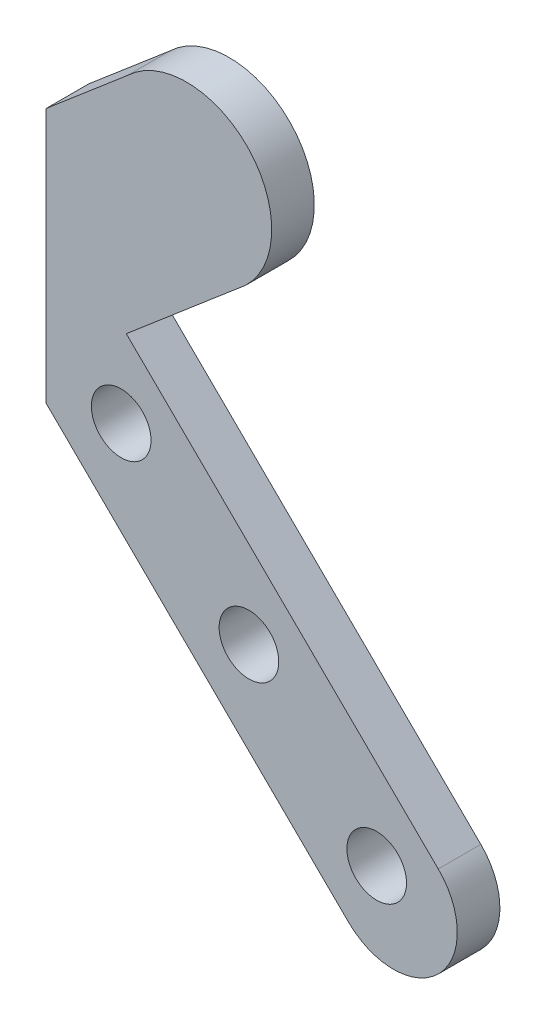
ISO-10303-21;
HEADER;
FILE_DESCRIPTION(('STEP AP214'),'2;1');
FILE_NAME('part.step','',(''),(''),'','','');
FILE_SCHEMA(('AUTOMOTIVE_DESIGN { 1 0 10303 214 1 1 1 1 }'));
ENDSEC;
DATA;
#1=APPLICATION_CONTEXT('core data for automotive mechanical design processes');
#2=APPLICATION_PROTOCOL_DEFINITION('international standard','automotive_design',2000,#1);
#3=PRODUCT_CONTEXT('',#1,'mechanical');
#4=PRODUCT('Part','Part','',(#3));
#5=PRODUCT_RELATED_PRODUCT_CATEGORY('part','',(#4));
#6=PRODUCT_DEFINITION_FORMATION('','',#4);
#7=PRODUCT_DEFINITION_CONTEXT('part definition',#1,'design');
#8=PRODUCT_DEFINITION('design','',#6,#7);
#9=PRODUCT_DEFINITION_SHAPE('','',#8);
#10=(LENGTH_UNIT() NAMED_UNIT(*) SI_UNIT(.MILLI.,.METRE.));
#11=(NAMED_UNIT(*) PLANE_ANGLE_UNIT() SI_UNIT($,.RADIAN.));
#12=(NAMED_UNIT(*) SI_UNIT($,.STERADIAN.) SOLID_ANGLE_UNIT());
#13=UNCERTAINTY_MEASURE_WITH_UNIT(LENGTH_MEASURE(1.E-05),#10,'distance_accuracy_value','');
#14=(GEOMETRIC_REPRESENTATION_CONTEXT(3) GLOBAL_UNCERTAINTY_ASSIGNED_CONTEXT((#13)) GLOBAL_UNIT_ASSIGNED_CONTEXT((#10,
#11,#12)) REPRESENTATION_CONTEXT('',''));
#15=CARTESIAN_POINT('',(0.,0.,0.));
#16=DIRECTION('',(0.,0.,1.));
#17=DIRECTION('',(1.,0.,0.));
#18=AXIS2_PLACEMENT_3D('',#15,#16,#17);
#19=CARTESIAN_POINT('',(5.54977373916184,-33.3031172111803,10.));
#20=DIRECTION('',(0.648204247100734,-0.761466515377118,0.));
#21=DIRECTION('',(0.761466515377118,0.648204247100734,0.));
#22=AXIS2_PLACEMENT_3D('',#19,#20,#21);
#23=PLANE('',#22);
#24=DIRECTION('',(-0.761466515377118,-0.648204247100734,0.));
#25=VECTOR('',#24,1.);
#26=CARTESIAN_POINT('',(5.54977373916184,-33.3031172111803,0.));
#27=LINE('',#26,#25);
#28=CARTESIAN_POINT('',(24.5864366235898,-17.098011033662,0.));
#29=VERTEX_POINT('',#28);
#30=CARTESIAN_POINT('',(5.54977373916184,-33.3031172111803,0.));
#31=VERTEX_POINT('',#30);
#32=EDGE_CURVE('E123',#29,#31,#27,.T.);
#33=ORIENTED_EDGE('',*,*,#32,.T.);
#34=DIRECTION('',(0.,0.,-1.));
#35=VECTOR('',#34,1.);
#36=CARTESIAN_POINT('',(5.54977373916184,-33.3031172111803,10.));
#37=LINE('',#36,#35);
#38=CARTESIAN_POINT('',(5.54977373916184,-33.3031172111803,10.));
#39=VERTEX_POINT('',#38);
#40=EDGE_CURVE('E11',#39,#31,#37,.T.);
#41=ORIENTED_EDGE('',*,*,#40,.F.);
#42=DIRECTION('',(-0.761466515377118,-0.648204247100734,0.));
#43=VECTOR('',#42,1.);
#44=CARTESIAN_POINT('',(5.54977373916184,-33.3031172111803,10.));
#45=LINE('',#44,#43);
#46=CARTESIAN_POINT('',(24.5864366235898,-17.098011033662,10.));
#47=VERTEX_POINT('',#46);
#48=EDGE_CURVE('E136',#47,#39,#45,.T.);
#49=ORIENTED_EDGE('',*,*,#48,.F.);
#50=DIRECTION('',(0.,0.,-1.));
#51=VECTOR('',#50,1.);
#52=CARTESIAN_POINT('',(24.5864366235898,-17.098011033662,10.));
#53=LINE('',#52,#51);
#54=EDGE_CURVE('E119',#47,#29,#53,.T.);
#55=ORIENTED_EDGE('',*,*,#54,.T.);
#56=EDGE_LOOP('',(#33,#41,#49,#55));
#57=FACE_BOUND('',#56,.T.);
#58=ADVANCED_FACE('F33',(#57),#23,.F.);
#59=CARTESIAN_POINT('',(5.54977373916184,-33.3031172111803,10.));
#60=DIRECTION('',(1.,0.,0.));
#61=DIRECTION('',(0.,1.,0.));
#62=AXIS2_PLACEMENT_3D('',#59,#60,#61);
#63=PLANE('',#62);
#64=DIRECTION('',(0.,-1.,0.));
#65=VECTOR('',#64,1.);
#66=CARTESIAN_POINT('',(5.54977373916184,-33.3031172111803,0.));
#67=LINE('',#66,#65);
#68=CARTESIAN_POINT('',(5.54977373916185,-93.3031172111803,0.));
#69=VERTEX_POINT('',#68);
#70=EDGE_CURVE('E126',#31,#69,#67,.T.);
#71=ORIENTED_EDGE('',*,*,#70,.T.);
#72=DIRECTION('',(0.,0.,-1.));
#73=VECTOR('',#72,1.);
#74=CARTESIAN_POINT('',(5.54977373916185,-93.3031172111803,10.));
#75=LINE('',#74,#73);
#76=CARTESIAN_POINT('',(5.54977373916185,-93.3031172111803,10.));
#77=VERTEX_POINT('',#76);
#78=EDGE_CURVE('E41',#77,#69,#75,.T.);
#79=ORIENTED_EDGE('',*,*,#78,.F.);
#80=DIRECTION('',(0.,-1.,0.));
#81=VECTOR('',#80,1.);
#82=CARTESIAN_POINT('',(5.54977373916184,-33.3031172111803,10.));
#83=LINE('',#82,#81);
#84=EDGE_CURVE('E89',#39,#77,#83,.T.);
#85=ORIENTED_EDGE('',*,*,#84,.F.);
#86=ORIENTED_EDGE('',*,*,#40,.T.);
#87=EDGE_LOOP('',(#71,#79,#85,#86));
#88=FACE_BOUND('',#87,.T.);
#89=ADVANCED_FACE('F208',(#88),#63,.F.);
#90=CARTESIAN_POINT('',(5.54977373916185,-93.3031172111803,10.));
#91=DIRECTION('',(0.702074182784828,0.712103813967469,0.));
#92=DIRECTION('',(-0.712103813967469,0.702074182784828,0.));
#93=AXIS2_PLACEMENT_3D('',#90,#91,#92);
#94=PLANE('',#93);
#95=DIRECTION('',(0.712103813967469,-0.702074182784828,0.));
#96=VECTOR('',#95,1.);
#97=CARTESIAN_POINT('',(5.54977373916185,-93.3031172111803,0.));
#98=LINE('',#97,#96);
#99=CARTESIAN_POINT('',(76.5497737391619,-163.30311721118,0.));
#100=VERTEX_POINT('',#99);
#101=EDGE_CURVE('E129',#69,#100,#98,.T.);
#102=ORIENTED_EDGE('',*,*,#101,.T.);
#103=DIRECTION('',(0.,0.,-1.));
#104=VECTOR('',#103,1.);
#105=CARTESIAN_POINT('',(76.5497737391619,-163.30311721118,10.));
#106=LINE('',#105,#104);
#107=CARTESIAN_POINT('',(76.5497737391619,-163.30311721118,10.));
#108=VERTEX_POINT('',#107);
#109=EDGE_CURVE('E140',#108,#100,#106,.T.);
#110=ORIENTED_EDGE('',*,*,#109,.F.);
#111=DIRECTION('',(0.712103813967469,-0.702074182784828,0.));
#112=VECTOR('',#111,1.);
#113=CARTESIAN_POINT('',(5.54977373916185,-93.3031172111803,10.));
#114=LINE('',#113,#112);
#115=EDGE_CURVE('E148',#77,#108,#114,.T.);
#116=ORIENTED_EDGE('',*,*,#115,.F.);
#117=ORIENTED_EDGE('',*,*,#78,.T.);
#118=EDGE_LOOP('',(#102,#110,#116,#117));
#119=FACE_BOUND('',#118,.T.);
#120=ADVANCED_FACE('F146',(#119),#94,.F.);
#121=CARTESIAN_POINT('',(87.0808864809343,-152.621560001668,10.));
#122=DIRECTION('',(0.,0.,-1.));
#123=DIRECTION('',(-1.,0.,0.));
#124=AXIS2_PLACEMENT_3D('',#121,#122,#123);
#125=CYLINDRICAL_SURFACE('',#124,15.);
#126=CARTESIAN_POINT('',(87.0808864809343,-152.621560001668,0.));
#127=DIRECTION('',(0.,0.,1.));
#128=DIRECTION('',(1.,0.,0.));
#129=AXIS2_PLACEMENT_3D('',#126,#127,#128);
#130=CIRCLE('',#129,15.);
#131=CARTESIAN_POINT('',(97.6119992227067,-141.940002792156,0.));
#132=VERTEX_POINT('',#131);
#133=EDGE_CURVE('E131',#100,#132,#130,.T.);
#134=ORIENTED_EDGE('',*,*,#133,.T.);
#135=DIRECTION('',(0.,0.,-1.));
#136=VECTOR('',#135,1.);
#137=CARTESIAN_POINT('',(97.6119992227067,-141.940002792156,10.));
#138=LINE('',#137,#136);
#139=CARTESIAN_POINT('',(97.6119992227067,-141.940002792156,10.));
#140=VERTEX_POINT('',#139);
#141=EDGE_CURVE('E114',#140,#132,#138,.T.);
#142=ORIENTED_EDGE('',*,*,#141,.F.);
#143=CARTESIAN_POINT('',(87.0808864809343,-152.621560001668,10.));
#144=DIRECTION('',(0.,0.,1.));
#145=DIRECTION('',(1.,0.,0.));
#146=AXIS2_PLACEMENT_3D('',#143,#144,#145);
#147=CIRCLE('',#146,15.);
#148=EDGE_CURVE('E105',#108,#140,#147,.T.);
#149=ORIENTED_EDGE('',*,*,#148,.F.);
#150=ORIENTED_EDGE('',*,*,#109,.T.);
#151=EDGE_LOOP('',(#134,#142,#149,#150));
#152=FACE_BOUND('',#151,.T.);
#153=ADVANCED_FACE('F154',(#152),#125,.T.);
#154=CARTESIAN_POINT('',(97.6119992227067,-141.940002792156,10.));
#155=DIRECTION('',(-0.702074182784828,-0.712103813967469,0.));
#156=DIRECTION('',(0.712103813967469,-0.702074182784828,0.));
#157=AXIS2_PLACEMENT_3D('',#154,#155,#156);
#158=PLANE('',#157);
#159=DIRECTION('',(-0.712103813967469,0.702074182784828,0.));
#160=VECTOR('',#159,1.);
#161=CARTESIAN_POINT('',(97.6119992227067,-141.940002792156,0.));
#162=LINE('',#161,#160);
#163=CARTESIAN_POINT('',(24.3558809134944,-69.7156607971582,0.));
#164=VERTEX_POINT('',#163);
#165=EDGE_CURVE('E113',#132,#164,#162,.T.);
#166=ORIENTED_EDGE('',*,*,#165,.T.);
#167=DIRECTION('',(0.,0.,-1.));
#168=VECTOR('',#167,1.);
#169=CARTESIAN_POINT('',(24.3558809134944,-69.7156607971582,10.));
#170=LINE('',#169,#168);
#171=CARTESIAN_POINT('',(24.3558809134944,-69.7156607971582,10.));
#172=VERTEX_POINT('',#171);
#173=EDGE_CURVE('E110',#172,#164,#170,.T.);
#174=ORIENTED_EDGE('',*,*,#173,.F.);
#175=DIRECTION('',(-0.712103813967469,0.702074182784828,0.));
#176=VECTOR('',#175,1.);
#177=CARTESIAN_POINT('',(97.6119992227067,-141.940002792156,10.));
#178=LINE('',#177,#176);
#179=EDGE_CURVE('E99',#140,#172,#178,.T.);
#180=ORIENTED_EDGE('',*,*,#179,.F.);
#181=ORIENTED_EDGE('',*,*,#141,.T.);
#182=EDGE_LOOP('',(#166,#174,#180,#181));
#183=FACE_BOUND('',#182,.T.);
#184=ADVANCED_FACE('F111',(#183),#158,.F.);
#185=CARTESIAN_POINT('',(24.3558809134944,-69.7156607971582,10.));
#186=DIRECTION('',(-0.648204247100734,0.761466515377118,0.));
#187=DIRECTION('',(-0.761466515377118,-0.648204247100734,0.));
#188=AXIS2_PLACEMENT_3D('',#185,#186,#187);
#189=PLANE('',#188);
#190=DIRECTION('',(0.761466515377118,0.648204247100734,0.));
#191=VECTOR('',#190,1.);
#192=CARTESIAN_POINT('',(24.3558809134944,-69.7156607971582,0.));
#193=LINE('',#192,#191);
#194=CARTESIAN_POINT('',(52.4204851505876,-45.8254498787232,0.));
#195=VERTEX_POINT('',#194);
#196=EDGE_CURVE('E75',#164,#195,#193,.T.);
#197=ORIENTED_EDGE('',*,*,#196,.T.);
#198=DIRECTION('',(0.,0.,-1.));
#199=VECTOR('',#198,1.);
#200=CARTESIAN_POINT('',(52.4204851505876,-45.8254498787232,10.));
#201=LINE('',#200,#199);
#202=CARTESIAN_POINT('',(52.4204851505876,-45.8254498787232,10.));
#203=VERTEX_POINT('',#202);
#204=EDGE_CURVE('E115',#203,#195,#201,.T.);
#205=ORIENTED_EDGE('',*,*,#204,.F.);
#206=DIRECTION('',(0.761466515377118,0.648204247100734,0.));
#207=VECTOR('',#206,1.);
#208=CARTESIAN_POINT('',(24.3558809134944,-69.7156607971582,10.));
#209=LINE('',#208,#207);
#210=EDGE_CURVE('E103',#172,#203,#209,.T.);
#211=ORIENTED_EDGE('',*,*,#210,.F.);
#212=ORIENTED_EDGE('',*,*,#173,.T.);
#213=EDGE_LOOP('',(#197,#205,#211,#212));
#214=FACE_BOUND('',#213,.T.);
#215=ADVANCED_FACE('F117',(#214),#189,.F.);
#216=CARTESIAN_POINT('',(38.5034608870887,-31.4617304561926,10.));
#217=DIRECTION('',(0.,0.,-1.));
#218=DIRECTION('',(-1.,0.,0.));
#219=AXIS2_PLACEMENT_3D('',#216,#217,#218);
#220=CYLINDRICAL_SURFACE('',#219,20.);
#221=CARTESIAN_POINT('',(38.5034608870887,-31.4617304561926,0.));
#222=DIRECTION('',(0.,0.,1.));
#223=DIRECTION('',(-1.,0.,0.));
#224=AXIS2_PLACEMENT_3D('',#221,#222,#223);
#225=CIRCLE('',#224,20.);
#226=EDGE_CURVE('E81',#195,#29,#225,.T.);
#227=ORIENTED_EDGE('',*,*,#226,.T.);
#228=ORIENTED_EDGE('',*,*,#54,.F.);
#229=CARTESIAN_POINT('',(38.5034608870887,-31.4617304561926,10.));
#230=DIRECTION('',(0.,0.,1.));
#231=DIRECTION('',(-1.,0.,0.));
#232=AXIS2_PLACEMENT_3D('',#229,#230,#231);
#233=CIRCLE('',#232,20.);
#234=EDGE_CURVE('E49',#203,#47,#233,.T.);
#235=ORIENTED_EDGE('',*,*,#234,.F.);
#236=ORIENTED_EDGE('',*,*,#204,.T.);
#237=EDGE_LOOP('',(#227,#228,#235,#236));
#238=FACE_BOUND('',#237,.T.);
#239=ADVANCED_FACE('F188',(#238),#220,.T.);
#240=CARTESIAN_POINT('',(38.5034608870887,-31.4617304561926,10.));
#241=DIRECTION('',(0.,0.,-1.));
#242=DIRECTION('',(-1.,0.,0.));
#243=AXIS2_PLACEMENT_3D('',#240,#241,#242);
#244=PLANE('',#243);
#245=CARTESIAN_POINT('',(23.1518838687667,-88.542112921762,10.));
#246=DIRECTION('',(0.,0.,1.));
#247=DIRECTION('',(1.,0.,0.));
#248=AXIS2_PLACEMENT_3D('',#245,#246,#247);
#249=CIRCLE('',#248,7.);
#250=CARTESIAN_POINT('',(30.1518838687667,-88.542112921762,10.));
#251=VERTEX_POINT('',#250);
#252=EDGE_CURVE('E171',#251,#251,#249,.T.);
#253=ORIENTED_EDGE('',*,*,#252,.F.);
#254=EDGE_LOOP('',(#253));
#255=FACE_BOUND('',#254,.T.);
#256=CARTESIAN_POINT('',(53.1518838687668,-118.542112921762,10.));
#257=DIRECTION('',(0.,0.,1.));
#258=DIRECTION('',(1.,0.,0.));
#259=AXIS2_PLACEMENT_3D('',#256,#257,#258);
#260=CIRCLE('',#259,7.);
#261=CARTESIAN_POINT('',(60.1518838687668,-118.542112921762,10.));
#262=VERTEX_POINT('',#261);
#263=EDGE_CURVE('E165',#262,#262,#260,.T.);
#264=ORIENTED_EDGE('',*,*,#263,.F.);
#265=EDGE_LOOP('',(#264));
#266=FACE_BOUND('',#265,.T.);
#267=CARTESIAN_POINT('',(83.1518838687667,-148.542112921761,10.));
#268=DIRECTION('',(0.,0.,1.));
#269=DIRECTION('',(1.,0.,0.));
#270=AXIS2_PLACEMENT_3D('',#267,#268,#269);
#271=CIRCLE('',#270,6.99999999999999);
#272=CARTESIAN_POINT('',(90.1518838687667,-148.542112921761,10.));
#273=VERTEX_POINT('',#272);
#274=EDGE_CURVE('E159',#273,#273,#271,.T.);
#275=ORIENTED_EDGE('',*,*,#274,.F.);
#276=EDGE_LOOP('',(#275));
#277=FACE_BOUND('',#276,.T.);
#278=ORIENTED_EDGE('',*,*,#48,.T.);
#279=ORIENTED_EDGE('',*,*,#84,.T.);
#280=ORIENTED_EDGE('',*,*,#115,.T.);
#281=ORIENTED_EDGE('',*,*,#148,.T.);
#282=ORIENTED_EDGE('',*,*,#179,.T.);
#283=ORIENTED_EDGE('',*,*,#210,.T.);
#284=ORIENTED_EDGE('',*,*,#234,.T.);
#285=EDGE_LOOP('',(#278,#279,#280,#281,#282,#283,#284));
#286=FACE_BOUND('',#285,.T.);
#287=ADVANCED_FACE('F101',(#255,#266,#277,#286),#244,.F.);
#288=CARTESIAN_POINT('',(38.5034608870887,-31.4617304561926,0.));
#289=DIRECTION('',(0.,0.,-1.));
#290=DIRECTION('',(-1.,0.,0.));
#291=AXIS2_PLACEMENT_3D('',#288,#289,#290);
#292=PLANE('',#291);
#293=CARTESIAN_POINT('',(23.1518838687667,-88.542112921762,0.));
#294=DIRECTION('',(0.,0.,1.));
#295=DIRECTION('',(1.,0.,0.));
#296=AXIS2_PLACEMENT_3D('',#293,#294,#295);
#297=CIRCLE('',#296,7.);
#298=CARTESIAN_POINT('',(30.1518838687667,-88.542112921762,0.));
#299=VERTEX_POINT('',#298);
#300=EDGE_CURVE('E127',#299,#299,#297,.T.);
#301=ORIENTED_EDGE('',*,*,#300,.T.);
#302=EDGE_LOOP('',(#301));
#303=FACE_BOUND('',#302,.T.);
#304=CARTESIAN_POINT('',(53.1518838687668,-118.542112921762,0.));
#305=DIRECTION('',(0.,0.,1.));
#306=DIRECTION('',(1.,0.,0.));
#307=AXIS2_PLACEMENT_3D('',#304,#305,#306);
#308=CIRCLE('',#307,7.);
#309=CARTESIAN_POINT('',(60.1518838687668,-118.542112921762,0.));
#310=VERTEX_POINT('',#309);
#311=EDGE_CURVE('E168',#310,#310,#308,.T.);
#312=ORIENTED_EDGE('',*,*,#311,.T.);
#313=EDGE_LOOP('',(#312));
#314=FACE_BOUND('',#313,.T.);
#315=CARTESIAN_POINT('',(83.1518838687667,-148.542112921761,0.));
#316=DIRECTION('',(0.,0.,1.));
#317=DIRECTION('',(1.,0.,0.));
#318=AXIS2_PLACEMENT_3D('',#315,#316,#317);
#319=CIRCLE('',#318,6.99999999999999);
#320=CARTESIAN_POINT('',(90.1518838687667,-148.542112921761,0.));
#321=VERTEX_POINT('',#320);
#322=EDGE_CURVE('E162',#321,#321,#319,.T.);
#323=ORIENTED_EDGE('',*,*,#322,.T.);
#324=EDGE_LOOP('',(#323));
#325=FACE_BOUND('',#324,.T.);
#326=ORIENTED_EDGE('',*,*,#32,.F.);
#327=ORIENTED_EDGE('',*,*,#226,.F.);
#328=ORIENTED_EDGE('',*,*,#196,.F.);
#329=ORIENTED_EDGE('',*,*,#165,.F.);
#330=ORIENTED_EDGE('',*,*,#133,.F.);
#331=ORIENTED_EDGE('',*,*,#101,.F.);
#332=ORIENTED_EDGE('',*,*,#70,.F.);
#333=EDGE_LOOP('',(#326,#327,#328,#329,#330,#331,#332));
#334=FACE_BOUND('',#333,.T.);
#335=ADVANCED_FACE('F152',(#303,#314,#325,#334),#292,.T.);
#336=CARTESIAN_POINT('',(83.1518838687667,-148.542112921761,0.));
#337=DIRECTION('',(0.,0.,1.));
#338=DIRECTION('',(1.,0.,0.));
#339=AXIS2_PLACEMENT_3D('',#336,#337,#338);
#340=CYLINDRICAL_SURFACE('',#339,6.99999999999999);
#341=ORIENTED_EDGE('',*,*,#322,.F.);
#342=EDGE_LOOP('',(#341));
#343=FACE_BOUND('',#342,.T.);
#344=ORIENTED_EDGE('',*,*,#274,.T.);
#345=EDGE_LOOP('',(#344));
#346=FACE_BOUND('',#345,.T.);
#347=ADVANCED_FACE('F194',(#343,#346),#340,.F.);
#348=CARTESIAN_POINT('',(53.1518838687668,-118.542112921762,0.));
#349=DIRECTION('',(0.,0.,1.));
#350=DIRECTION('',(1.,0.,0.));
#351=AXIS2_PLACEMENT_3D('',#348,#349,#350);
#352=CYLINDRICAL_SURFACE('',#351,7.);
#353=ORIENTED_EDGE('',*,*,#311,.F.);
#354=EDGE_LOOP('',(#353));
#355=FACE_BOUND('',#354,.T.);
#356=ORIENTED_EDGE('',*,*,#263,.T.);
#357=EDGE_LOOP('',(#356));
#358=FACE_BOUND('',#357,.T.);
#359=ADVANCED_FACE('F182',(#355,#358),#352,.F.);
#360=CARTESIAN_POINT('',(23.1518838687667,-88.542112921762,0.));
#361=DIRECTION('',(0.,0.,1.));
#362=DIRECTION('',(1.,0.,0.));
#363=AXIS2_PLACEMENT_3D('',#360,#361,#362);
#364=CYLINDRICAL_SURFACE('',#363,7.);
#365=ORIENTED_EDGE('',*,*,#300,.F.);
#366=EDGE_LOOP('',(#365));
#367=FACE_BOUND('',#366,.T.);
#368=ORIENTED_EDGE('',*,*,#252,.T.);
#369=EDGE_LOOP('',(#368));
#370=FACE_BOUND('',#369,.T.);
#371=ADVANCED_FACE('F179',(#367,#370),#364,.F.);
#372=CLOSED_SHELL('',(#58,#89,#120,#153,#184,#215,#239,#287,#335,#347,#359,#371));
#373=MANIFOLD_SOLID_BREP('B2',#372);
#374=ADVANCED_BREP_SHAPE_REPRESENTATION('',(#18,#373),#14);
#375=SHAPE_DEFINITION_REPRESENTATION(#9,#374);
ENDSEC;
END-ISO-10303-21;
